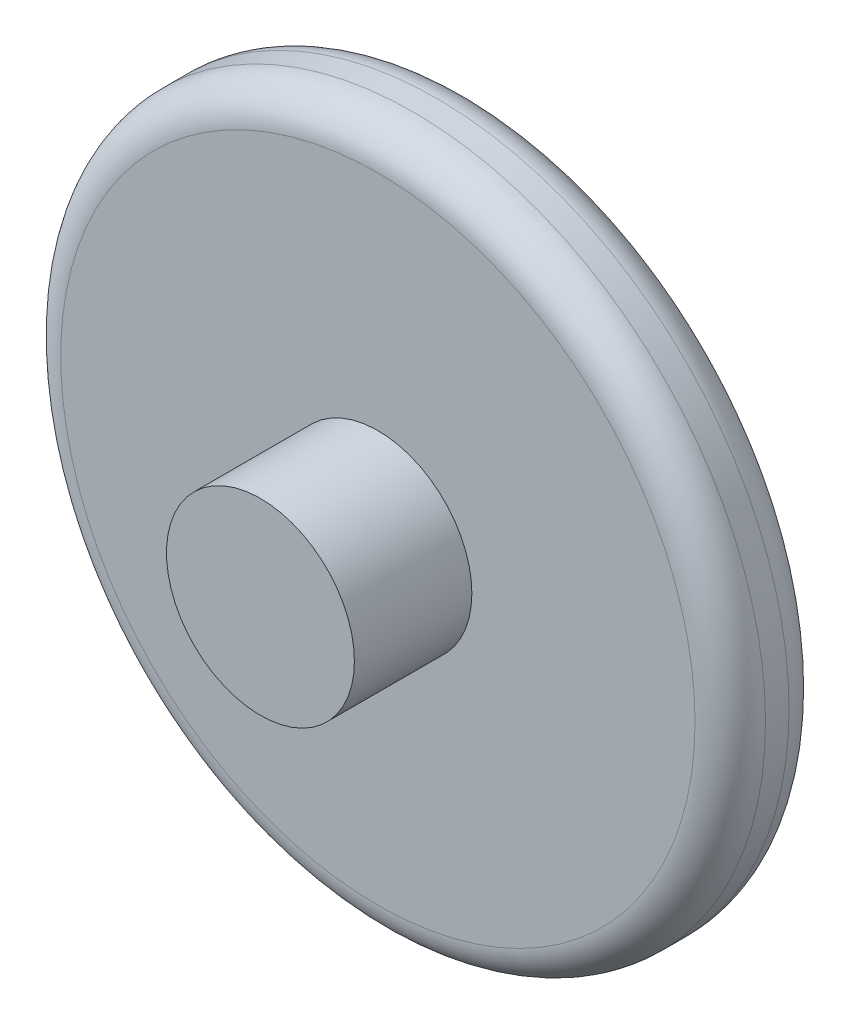
ISO-10303-21;
HEADER;
FILE_DESCRIPTION(('STEP AP214'),'2;1');
FILE_NAME('part.step','',(''),(''),'','','');
FILE_SCHEMA(('AUTOMOTIVE_DESIGN { 1 0 10303 214 1 1 1 1 }'));
ENDSEC;
DATA;
#1=APPLICATION_CONTEXT('core data for automotive mechanical design processes');
#2=APPLICATION_PROTOCOL_DEFINITION('international standard','automotive_design',2000,#1);
#3=PRODUCT_CONTEXT('',#1,'mechanical');
#4=PRODUCT('Part','Part','',(#3));
#5=PRODUCT_RELATED_PRODUCT_CATEGORY('part','',(#4));
#6=PRODUCT_DEFINITION_FORMATION('','',#4);
#7=PRODUCT_DEFINITION_CONTEXT('part definition',#1,'design');
#8=PRODUCT_DEFINITION('design','',#6,#7);
#9=PRODUCT_DEFINITION_SHAPE('','',#8);
#10=(LENGTH_UNIT() NAMED_UNIT(*) SI_UNIT(.MILLI.,.METRE.));
#11=(NAMED_UNIT(*) PLANE_ANGLE_UNIT() SI_UNIT($,.RADIAN.));
#12=(NAMED_UNIT(*) SI_UNIT($,.STERADIAN.) SOLID_ANGLE_UNIT());
#13=UNCERTAINTY_MEASURE_WITH_UNIT(LENGTH_MEASURE(1.E-05),#10,'distance_accuracy_value','');
#14=(GEOMETRIC_REPRESENTATION_CONTEXT(3) GLOBAL_UNCERTAINTY_ASSIGNED_CONTEXT((#13)) GLOBAL_UNIT_ASSIGNED_CONTEXT((#10,
#11,#12)) REPRESENTATION_CONTEXT('',''));
#15=CARTESIAN_POINT('',(0.,0.,0.));
#16=DIRECTION('',(0.,0.,1.));
#17=DIRECTION('',(1.,0.,0.));
#18=AXIS2_PLACEMENT_3D('',#15,#16,#17);
#19=CARTESIAN_POINT('',(0.,0.,8.));
#20=DIRECTION('',(0.,0.,-1.));
#21=DIRECTION('',(-1.,0.,0.));
#22=AXIS2_PLACEMENT_3D('',#19,#20,#21);
#23=CYLINDRICAL_SURFACE('',#22,30.);
#24=CARTESIAN_POINT('',(0.,0.,3.));
#25=DIRECTION('',(0.,0.,1.));
#26=DIRECTION('',(1.,0.,0.));
#27=AXIS2_PLACEMENT_3D('',#24,#25,#26);
#28=CIRCLE('',#27,30.);
#29=CARTESIAN_POINT('',(30.,0.,3.));
#30=VERTEX_POINT('',#29);
#31=EDGE_CURVE('E42',#30,#30,#28,.T.);
#32=ORIENTED_EDGE('',*,*,#31,.T.);
#33=EDGE_LOOP('',(#32));
#34=FACE_BOUND('',#33,.T.);
#35=CARTESIAN_POINT('',(0.,0.,5.));
#36=DIRECTION('',(0.,0.,1.));
#37=DIRECTION('',(1.,0.,0.));
#38=AXIS2_PLACEMENT_3D('',#35,#36,#37);
#39=CIRCLE('',#38,30.);
#40=CARTESIAN_POINT('',(30.,0.,5.));
#41=VERTEX_POINT('',#40);
#42=EDGE_CURVE('E46',#41,#41,#39,.F.);
#43=ORIENTED_EDGE('',*,*,#42,.T.);
#44=EDGE_LOOP('',(#43));
#45=FACE_BOUND('',#44,.T.);
#46=ADVANCED_FACE('F31',(#34,#45),#23,.T.);
#47=CARTESIAN_POINT('',(0.,0.,8.));
#48=DIRECTION('',(0.,0.,1.));
#49=DIRECTION('',(1.,0.,0.));
#50=AXIS2_PLACEMENT_3D('',#47,#48,#49);
#51=PLANE('',#50);
#52=CARTESIAN_POINT('',(0.,0.,8.));
#53=DIRECTION('',(0.,0.,1.));
#54=DIRECTION('',(1.,0.,0.));
#55=AXIS2_PLACEMENT_3D('',#52,#53,#54);
#56=CIRCLE('',#55,27.);
#57=CARTESIAN_POINT('',(27.,0.,8.));
#58=VERTEX_POINT('',#57);
#59=EDGE_CURVE('E10',#58,#58,#56,.T.);
#60=ORIENTED_EDGE('',*,*,#59,.T.);
#61=EDGE_LOOP('',(#60));
#62=FACE_BOUND('',#61,.T.);
#63=CARTESIAN_POINT('',(0.,0.,8.));
#64=DIRECTION('',(0.,0.,1.));
#65=DIRECTION('',(1.,0.,0.));
#66=AXIS2_PLACEMENT_3D('',#63,#64,#65);
#67=CIRCLE('',#66,8.);
#68=CARTESIAN_POINT('',(8.,0.,8.));
#69=VERTEX_POINT('',#68);
#70=EDGE_CURVE('E52',#69,#69,#67,.T.);
#71=ORIENTED_EDGE('',*,*,#70,.F.);
#72=EDGE_LOOP('',(#71));
#73=FACE_BOUND('',#72,.T.);
#74=ADVANCED_FACE('F67',(#62,#73),#51,.T.);
#75=CARTESIAN_POINT('',(0.,0.,0.));
#76=DIRECTION('',(0.,0.,1.));
#77=DIRECTION('',(1.,0.,0.));
#78=AXIS2_PLACEMENT_3D('',#75,#76,#77);
#79=PLANE('',#78);
#80=CARTESIAN_POINT('',(0.,0.,0.));
#81=DIRECTION('',(0.,0.,1.));
#82=DIRECTION('',(1.,0.,0.));
#83=AXIS2_PLACEMENT_3D('',#80,#81,#82);
#84=CIRCLE('',#83,27.);
#85=CARTESIAN_POINT('',(27.,0.,0.));
#86=VERTEX_POINT('',#85);
#87=EDGE_CURVE('E38',#86,#86,#84,.F.);
#88=ORIENTED_EDGE('',*,*,#87,.T.);
#89=EDGE_LOOP('',(#88));
#90=FACE_BOUND('',#89,.T.);
#91=ADVANCED_FACE('F63',(#90),#79,.F.);
#92=CARTESIAN_POINT('',(0.,0.,18.));
#93=DIRECTION('',(0.,0.,-1.));
#94=DIRECTION('',(-1.,0.,0.));
#95=AXIS2_PLACEMENT_3D('',#92,#93,#94);
#96=CYLINDRICAL_SURFACE('',#95,8.);
#97=CARTESIAN_POINT('',(0.,0.,18.));
#98=DIRECTION('',(0.,0.,1.));
#99=DIRECTION('',(1.,0.,0.));
#100=AXIS2_PLACEMENT_3D('',#97,#98,#99);
#101=CIRCLE('',#100,8.);
#102=CARTESIAN_POINT('',(8.,0.,18.));
#103=VERTEX_POINT('',#102);
#104=EDGE_CURVE('E51',#103,#103,#101,.T.);
#105=ORIENTED_EDGE('',*,*,#104,.F.);
#106=EDGE_LOOP('',(#105));
#107=FACE_BOUND('',#106,.T.);
#108=ORIENTED_EDGE('',*,*,#70,.T.);
#109=EDGE_LOOP('',(#108));
#110=FACE_BOUND('',#109,.T.);
#111=ADVANCED_FACE('F60',(#107,#110),#96,.T.);
#112=CARTESIAN_POINT('',(0.,0.,18.));
#113=DIRECTION('',(0.,0.,1.));
#114=DIRECTION('',(1.,0.,0.));
#115=AXIS2_PLACEMENT_3D('',#112,#113,#114);
#116=PLANE('',#115);
#117=ORIENTED_EDGE('',*,*,#104,.T.);
#118=EDGE_LOOP('',(#117));
#119=FACE_BOUND('',#118,.T.);
#120=ADVANCED_FACE('F58',(#119),#116,.T.);
#121=CARTESIAN_POINT('',(0.,0.,3.));
#122=DIRECTION('',(0.,0.,1.));
#123=DIRECTION('',(1.,0.,0.));
#124=AXIS2_PLACEMENT_3D('',#121,#122,#123);
#125=TOROIDAL_SURFACE('',#124,27.,3.);
#126=ORIENTED_EDGE('',*,*,#87,.F.);
#127=EDGE_LOOP('',(#126));
#128=FACE_BOUND('',#127,.T.);
#129=ORIENTED_EDGE('',*,*,#31,.F.);
#130=EDGE_LOOP('',(#129));
#131=FACE_BOUND('',#130,.T.);
#132=ADVANCED_FACE('F78',(#128,#131),#125,.T.);
#133=CARTESIAN_POINT('',(0.,0.,5.));
#134=DIRECTION('',(0.,0.,1.));
#135=DIRECTION('',(1.,0.,0.));
#136=AXIS2_PLACEMENT_3D('',#133,#134,#135);
#137=TOROIDAL_SURFACE('',#136,27.,3.);
#138=ORIENTED_EDGE('',*,*,#42,.F.);
#139=EDGE_LOOP('',(#138));
#140=FACE_BOUND('',#139,.T.);
#141=ORIENTED_EDGE('',*,*,#59,.F.);
#142=EDGE_LOOP('',(#141));
#143=FACE_BOUND('',#142,.T.);
#144=ADVANCED_FACE('F33',(#140,#143),#137,.T.);
#145=CLOSED_SHELL('',(#46,#74,#91,#111,#120,#132,#144));
#146=MANIFOLD_SOLID_BREP('B2',#145);
#147=ADVANCED_BREP_SHAPE_REPRESENTATION('',(#18,#146),#14);
#148=SHAPE_DEFINITION_REPRESENTATION(#9,#147);
ENDSEC;
END-ISO-10303-21;
